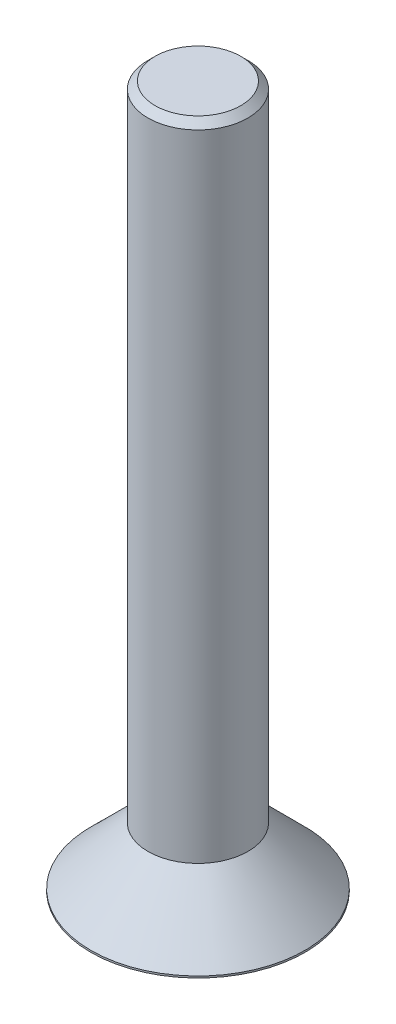
ISO-10303-21;
HEADER;
FILE_DESCRIPTION(('STEP AP214'),'2;1');
FILE_NAME('part.step','',(''),(''),'','','');
FILE_SCHEMA(('AUTOMOTIVE_DESIGN { 1 0 10303 214 1 1 1 1 }'));
ENDSEC;
DATA;
#1=APPLICATION_CONTEXT('core data for automotive mechanical design processes');
#2=APPLICATION_PROTOCOL_DEFINITION('international standard','automotive_design',2000,#1);
#3=PRODUCT_CONTEXT('',#1,'mechanical');
#4=PRODUCT('Part','Part','',(#3));
#5=PRODUCT_RELATED_PRODUCT_CATEGORY('part','',(#4));
#6=PRODUCT_DEFINITION_FORMATION('','',#4);
#7=PRODUCT_DEFINITION_CONTEXT('part definition',#1,'design');
#8=PRODUCT_DEFINITION('design','',#6,#7);
#9=PRODUCT_DEFINITION_SHAPE('','',#8);
#10=(LENGTH_UNIT() NAMED_UNIT(*) SI_UNIT(.MILLI.,.METRE.));
#11=(NAMED_UNIT(*) PLANE_ANGLE_UNIT() SI_UNIT($,.RADIAN.));
#12=(NAMED_UNIT(*) SI_UNIT($,.STERADIAN.) SOLID_ANGLE_UNIT());
#13=UNCERTAINTY_MEASURE_WITH_UNIT(LENGTH_MEASURE(1.E-05),#10,'distance_accuracy_value','');
#14=(GEOMETRIC_REPRESENTATION_CONTEXT(3) GLOBAL_UNCERTAINTY_ASSIGNED_CONTEXT((#13)) GLOBAL_UNIT_ASSIGNED_CONTEXT((#10,
#11,#12)) REPRESENTATION_CONTEXT('',''));
#15=CARTESIAN_POINT('',(0.,0.,0.));
#16=DIRECTION('',(0.,0.,1.));
#17=DIRECTION('',(1.,0.,0.));
#18=AXIS2_PLACEMENT_3D('',#15,#16,#17);
#19=CARTESIAN_POINT('',(0.,1.65,0.));
#20=DIRECTION('',(0.,-1.,0.));
#21=DIRECTION('',(0.,0.,-1.));
#22=AXIS2_PLACEMENT_3D('',#19,#20,#21);
#23=CYLINDRICAL_SURFACE('',#22,3.);
#24=CARTESIAN_POINT('',(0.,0.0499999999999921,0.));
#25=DIRECTION('',(0.,1.,0.));
#26=DIRECTION('',(0.,0.,1.));
#27=AXIS2_PLACEMENT_3D('',#24,#25,#26);
#28=CIRCLE('',#27,3.);
#29=CARTESIAN_POINT('',(0.,0.0499999999999921,3.));
#30=VERTEX_POINT('',#29);
#31=EDGE_CURVE('E150',#30,#30,#28,.F.);
#32=ORIENTED_EDGE('',*,*,#31,.T.);
#33=EDGE_LOOP('',(#32));
#34=FACE_BOUND('',#33,.T.);
#35=CARTESIAN_POINT('',(0.,0.,0.));
#36=DIRECTION('',(0.,1.,0.));
#37=DIRECTION('',(0.,0.,1.));
#38=AXIS2_PLACEMENT_3D('',#35,#36,#37);
#39=CIRCLE('',#38,3.);
#40=CARTESIAN_POINT('',(0.,0.,3.));
#41=VERTEX_POINT('',#40);
#42=EDGE_CURVE('E139',#41,#41,#39,.T.);
#43=ORIENTED_EDGE('',*,*,#42,.T.);
#44=EDGE_LOOP('',(#43));
#45=FACE_BOUND('',#44,.T.);
#46=ADVANCED_FACE('F36',(#34,#45),#23,.T.);
#47=CARTESIAN_POINT('',(0.,0.,0.));
#48=DIRECTION('',(0.,1.,0.));
#49=DIRECTION('',(0.,0.,1.));
#50=AXIS2_PLACEMENT_3D('',#47,#48,#49);
#51=PLANE('',#50);
#52=DIRECTION('',(0.,0.,1.));
#53=VECTOR('',#52,1.);
#54=CARTESIAN_POINT('',(1.,0.,-0.577350269189627));
#55=LINE('',#54,#53);
#56=CARTESIAN_POINT('',(1.,0.,-0.577350269189627));
#57=VERTEX_POINT('',#56);
#58=CARTESIAN_POINT('',(1.,0.,0.577350269189626));
#59=VERTEX_POINT('',#58);
#60=EDGE_CURVE('E126',#57,#59,#55,.T.);
#61=ORIENTED_EDGE('',*,*,#60,.F.);
#62=DIRECTION('',(0.866025403784439,0.,0.5));
#63=VECTOR('',#62,1.);
#64=CARTESIAN_POINT('',(0.,0.,-1.15470053837925));
#65=LINE('',#64,#63);
#66=CARTESIAN_POINT('',(0.,0.,-1.15470053837925));
#67=VERTEX_POINT('',#66);
#68=EDGE_CURVE('E52',#67,#57,#65,.T.);
#69=ORIENTED_EDGE('',*,*,#68,.F.);
#70=DIRECTION('',(0.866025403784439,0.,-0.5));
#71=VECTOR('',#70,1.);
#72=CARTESIAN_POINT('',(-1.,0.,-0.577350269189626));
#73=LINE('',#72,#71);
#74=CARTESIAN_POINT('',(-1.,0.,-0.577350269189626));
#75=VERTEX_POINT('',#74);
#76=EDGE_CURVE('E135',#75,#67,#73,.T.);
#77=ORIENTED_EDGE('',*,*,#76,.F.);
#78=DIRECTION('',(0.,0.,-1.));
#79=VECTOR('',#78,1.);
#80=CARTESIAN_POINT('',(-1.,0.,0.577350269189626));
#81=LINE('',#80,#79);
#82=CARTESIAN_POINT('',(-1.,0.,0.577350269189626));
#83=VERTEX_POINT('',#82);
#84=EDGE_CURVE('E133',#83,#75,#81,.T.);
#85=ORIENTED_EDGE('',*,*,#84,.F.);
#86=DIRECTION('',(-0.866025403784439,0.,-0.5));
#87=VECTOR('',#86,1.);
#88=CARTESIAN_POINT('',(0.,0.,1.15470053837925));
#89=LINE('',#88,#87);
#90=CARTESIAN_POINT('',(0.,0.,1.15470053837925));
#91=VERTEX_POINT('',#90);
#92=EDGE_CURVE('E100',#91,#83,#89,.T.);
#93=ORIENTED_EDGE('',*,*,#92,.F.);
#94=DIRECTION('',(-0.866025403784439,0.,0.5));
#95=VECTOR('',#94,1.);
#96=CARTESIAN_POINT('',(1.,0.,0.577350269189626));
#97=LINE('',#96,#95);
#98=EDGE_CURVE('E129',#59,#91,#97,.T.);
#99=ORIENTED_EDGE('',*,*,#98,.F.);
#100=EDGE_LOOP('',(#61,#69,#77,#85,#93,#99));
#101=FACE_BOUND('',#100,.T.);
#102=ORIENTED_EDGE('',*,*,#42,.F.);
#103=EDGE_LOOP('',(#102));
#104=FACE_BOUND('',#103,.T.);
#105=ADVANCED_FACE('F166',(#101,#104),#51,.F.);
#106=CARTESIAN_POINT('',(0.,1.65,0.));
#107=DIRECTION('',(0.,-1.,0.));
#108=DIRECTION('',(0.,0.,-1.));
#109=AXIS2_PLACEMENT_3D('',#106,#107,#108);
#110=CONICAL_SURFACE('',#109,1.4,0.785398163397447);
#111=ORIENTED_EDGE('',*,*,#31,.F.);
#112=EDGE_LOOP('',(#111));
#113=FACE_BOUND('',#112,.T.);
#114=CARTESIAN_POINT('',(0.,1.65,0.));
#115=DIRECTION('',(0.,1.,0.));
#116=DIRECTION('',(0.,0.,1.));
#117=AXIS2_PLACEMENT_3D('',#114,#115,#116);
#118=CIRCLE('',#117,1.4);
#119=CARTESIAN_POINT('',(0.,1.65,1.4));
#120=VERTEX_POINT('',#119);
#121=EDGE_CURVE('E147',#120,#120,#118,.T.);
#122=ORIENTED_EDGE('',*,*,#121,.F.);
#123=EDGE_LOOP('',(#122));
#124=FACE_BOUND('',#123,.T.);
#125=ADVANCED_FACE('F172',(#113,#124),#110,.T.);
#126=CARTESIAN_POINT('',(0.,0.95,-1.15470053837925));
#127=DIRECTION('',(0.5,0.,-0.866025403784439));
#128=DIRECTION('',(-0.866025403784439,0.,-0.5));
#129=AXIS2_PLACEMENT_3D('',#126,#127,#128);
#130=PLANE('',#129);
#131=ORIENTED_EDGE('',*,*,#68,.T.);
#132=DIRECTION('',(0.,-1.,0.));
#133=VECTOR('',#132,1.);
#134=CARTESIAN_POINT('',(1.,0.95,-0.577350269189627));
#135=LINE('',#134,#133);
#136=CARTESIAN_POINT('',(1.,0.95,-0.577350269189627));
#137=VERTEX_POINT('',#136);
#138=EDGE_CURVE('E82',#137,#57,#135,.T.);
#139=ORIENTED_EDGE('',*,*,#138,.F.);
#140=DIRECTION('',(0.866025403784439,0.,0.5));
#141=VECTOR('',#140,1.);
#142=CARTESIAN_POINT('',(0.,0.95,-1.15470053837925));
#143=LINE('',#142,#141);
#144=CARTESIAN_POINT('',(0.,0.95,-1.15470053837925));
#145=VERTEX_POINT('',#144);
#146=EDGE_CURVE('E137',#145,#137,#143,.T.);
#147=ORIENTED_EDGE('',*,*,#146,.F.);
#148=DIRECTION('',(0.,-1.,0.));
#149=VECTOR('',#148,1.);
#150=CARTESIAN_POINT('',(0.,0.95,-1.15470053837925));
#151=LINE('',#150,#149);
#152=EDGE_CURVE('E60',#145,#67,#151,.T.);
#153=ORIENTED_EDGE('',*,*,#152,.T.);
#154=EDGE_LOOP('',(#131,#139,#147,#153));
#155=FACE_BOUND('',#154,.T.);
#156=ADVANCED_FACE('F181',(#155),#130,.F.);
#157=CARTESIAN_POINT('',(-1.,0.95,-0.577350269189626));
#158=DIRECTION('',(-0.5,0.,-0.866025403784439));
#159=DIRECTION('',(-0.866025403784439,0.,0.5));
#160=AXIS2_PLACEMENT_3D('',#157,#158,#159);
#161=PLANE('',#160);
#162=ORIENTED_EDGE('',*,*,#76,.T.);
#163=ORIENTED_EDGE('',*,*,#152,.F.);
#164=DIRECTION('',(0.866025403784439,0.,-0.5));
#165=VECTOR('',#164,1.);
#166=CARTESIAN_POINT('',(-1.,0.95,-0.577350269189626));
#167=LINE('',#166,#165);
#168=CARTESIAN_POINT('',(-1.,0.95,-0.577350269189626));
#169=VERTEX_POINT('',#168);
#170=EDGE_CURVE('E112',#169,#145,#167,.T.);
#171=ORIENTED_EDGE('',*,*,#170,.F.);
#172=DIRECTION('',(0.,-1.,0.));
#173=VECTOR('',#172,1.);
#174=CARTESIAN_POINT('',(-1.,0.95,-0.577350269189626));
#175=LINE('',#174,#173);
#176=EDGE_CURVE('E104',#169,#75,#175,.T.);
#177=ORIENTED_EDGE('',*,*,#176,.T.);
#178=EDGE_LOOP('',(#162,#163,#171,#177));
#179=FACE_BOUND('',#178,.T.);
#180=ADVANCED_FACE('F186',(#179),#161,.F.);
#181=CARTESIAN_POINT('',(-1.,0.95,0.577350269189626));
#182=DIRECTION('',(-1.,0.,0.));
#183=DIRECTION('',(0.,0.,1.));
#184=AXIS2_PLACEMENT_3D('',#181,#182,#183);
#185=PLANE('',#184);
#186=ORIENTED_EDGE('',*,*,#84,.T.);
#187=ORIENTED_EDGE('',*,*,#176,.F.);
#188=DIRECTION('',(0.,0.,-1.));
#189=VECTOR('',#188,1.);
#190=CARTESIAN_POINT('',(-1.,0.95,0.577350269189626));
#191=LINE('',#190,#189);
#192=CARTESIAN_POINT('',(-1.,0.95,0.577350269189626));
#193=VERTEX_POINT('',#192);
#194=EDGE_CURVE('E108',#193,#169,#191,.T.);
#195=ORIENTED_EDGE('',*,*,#194,.F.);
#196=DIRECTION('',(0.,-1.,0.));
#197=VECTOR('',#196,1.);
#198=CARTESIAN_POINT('',(-1.,0.95,0.577350269189626));
#199=LINE('',#198,#197);
#200=EDGE_CURVE('E93',#193,#83,#199,.T.);
#201=ORIENTED_EDGE('',*,*,#200,.T.);
#202=EDGE_LOOP('',(#186,#187,#195,#201));
#203=FACE_BOUND('',#202,.T.);
#204=ADVANCED_FACE('F109',(#203),#185,.F.);
#205=CARTESIAN_POINT('',(0.,0.95,1.15470053837925));
#206=DIRECTION('',(-0.5,0.,0.866025403784439));
#207=DIRECTION('',(0.866025403784439,0.,0.5));
#208=AXIS2_PLACEMENT_3D('',#205,#206,#207);
#209=PLANE('',#208);
#210=ORIENTED_EDGE('',*,*,#92,.T.);
#211=ORIENTED_EDGE('',*,*,#200,.F.);
#212=DIRECTION('',(-0.866025403784439,0.,-0.5));
#213=VECTOR('',#212,1.);
#214=CARTESIAN_POINT('',(0.,0.95,1.15470053837925));
#215=LINE('',#214,#213);
#216=CARTESIAN_POINT('',(0.,0.95,1.15470053837925));
#217=VERTEX_POINT('',#216);
#218=EDGE_CURVE('E97',#217,#193,#215,.T.);
#219=ORIENTED_EDGE('',*,*,#218,.F.);
#220=DIRECTION('',(0.,-1.,0.));
#221=VECTOR('',#220,1.);
#222=CARTESIAN_POINT('',(0.,0.95,1.15470053837925));
#223=LINE('',#222,#221);
#224=EDGE_CURVE('E105',#217,#91,#223,.T.);
#225=ORIENTED_EDGE('',*,*,#224,.T.);
#226=EDGE_LOOP('',(#210,#211,#219,#225));
#227=FACE_BOUND('',#226,.T.);
#228=ADVANCED_FACE('F95',(#227),#209,.F.);
#229=CARTESIAN_POINT('',(1.,0.95,0.577350269189626));
#230=DIRECTION('',(0.5,0.,0.866025403784439));
#231=DIRECTION('',(0.866025403784439,0.,-0.5));
#232=AXIS2_PLACEMENT_3D('',#229,#230,#231);
#233=PLANE('',#232);
#234=ORIENTED_EDGE('',*,*,#98,.T.);
#235=ORIENTED_EDGE('',*,*,#224,.F.);
#236=DIRECTION('',(-0.866025403784439,0.,0.5));
#237=VECTOR('',#236,1.);
#238=CARTESIAN_POINT('',(1.,0.95,0.577350269189626));
#239=LINE('',#238,#237);
#240=CARTESIAN_POINT('',(1.,0.95,0.577350269189626));
#241=VERTEX_POINT('',#240);
#242=EDGE_CURVE('E118',#241,#217,#239,.T.);
#243=ORIENTED_EDGE('',*,*,#242,.F.);
#244=DIRECTION('',(0.,-1.,0.));
#245=VECTOR('',#244,1.);
#246=CARTESIAN_POINT('',(1.,0.95,0.577350269189626));
#247=LINE('',#246,#245);
#248=EDGE_CURVE('E142',#241,#59,#247,.T.);
#249=ORIENTED_EDGE('',*,*,#248,.T.);
#250=EDGE_LOOP('',(#234,#235,#243,#249));
#251=FACE_BOUND('',#250,.T.);
#252=ADVANCED_FACE('F206',(#251),#233,.F.);
#253=CARTESIAN_POINT('',(1.,0.95,-0.577350269189627));
#254=DIRECTION('',(1.,0.,0.));
#255=DIRECTION('',(0.,0.,-1.));
#256=AXIS2_PLACEMENT_3D('',#253,#254,#255);
#257=PLANE('',#256);
#258=ORIENTED_EDGE('',*,*,#60,.T.);
#259=ORIENTED_EDGE('',*,*,#248,.F.);
#260=DIRECTION('',(0.,0.,1.));
#261=VECTOR('',#260,1.);
#262=CARTESIAN_POINT('',(1.,0.95,-0.577350269189627));
#263=LINE('',#262,#261);
#264=EDGE_CURVE('E120',#137,#241,#263,.T.);
#265=ORIENTED_EDGE('',*,*,#264,.F.);
#266=ORIENTED_EDGE('',*,*,#138,.T.);
#267=EDGE_LOOP('',(#258,#259,#265,#266));
#268=FACE_BOUND('',#267,.T.);
#269=ADVANCED_FACE('F197',(#268),#257,.F.);
#270=CARTESIAN_POINT('',(0.,0.95,0.));
#271=DIRECTION('',(0.,-1.,0.));
#272=DIRECTION('',(0.,0.,-1.));
#273=AXIS2_PLACEMENT_3D('',#270,#271,#272);
#274=PLANE('',#273);
#275=ORIENTED_EDGE('',*,*,#146,.T.);
#276=ORIENTED_EDGE('',*,*,#264,.T.);
#277=ORIENTED_EDGE('',*,*,#242,.T.);
#278=ORIENTED_EDGE('',*,*,#218,.T.);
#279=ORIENTED_EDGE('',*,*,#194,.T.);
#280=ORIENTED_EDGE('',*,*,#170,.T.);
#281=EDGE_LOOP('',(#275,#276,#277,#278,#279,#280));
#282=FACE_BOUND('',#281,.T.);
#283=ADVANCED_FACE('F115',(#282),#274,.T.);
#284=CARTESIAN_POINT('',(0.,19.65,0.));
#285=DIRECTION('',(0.,-1.,0.));
#286=DIRECTION('',(0.,0.,-1.));
#287=AXIS2_PLACEMENT_3D('',#284,#285,#286);
#288=CYLINDRICAL_SURFACE('',#287,1.4);
#289=CARTESIAN_POINT('',(0.,19.45,0.));
#290=DIRECTION('',(0.,1.,0.));
#291=DIRECTION('',(0.,0.,1.));
#292=AXIS2_PLACEMENT_3D('',#289,#290,#291);
#293=CIRCLE('',#292,1.4);
#294=CARTESIAN_POINT('',(0.,19.45,1.4));
#295=VERTEX_POINT('',#294);
#296=EDGE_CURVE('E11',#295,#295,#293,.F.);
#297=ORIENTED_EDGE('',*,*,#296,.T.);
#298=EDGE_LOOP('',(#297));
#299=FACE_BOUND('',#298,.T.);
#300=ORIENTED_EDGE('',*,*,#121,.T.);
#301=EDGE_LOOP('',(#300));
#302=FACE_BOUND('',#301,.T.);
#303=ADVANCED_FACE('F162',(#299,#302),#288,.T.);
#304=CARTESIAN_POINT('',(0.,19.65,0.));
#305=DIRECTION('',(0.,1.,0.));
#306=DIRECTION('',(0.,0.,1.));
#307=AXIS2_PLACEMENT_3D('',#304,#305,#306);
#308=PLANE('',#307);
#309=CARTESIAN_POINT('',(0.,19.65,0.));
#310=DIRECTION('',(0.,1.,0.));
#311=DIRECTION('',(0.,0.,1.));
#312=AXIS2_PLACEMENT_3D('',#309,#310,#311);
#313=CIRCLE('',#312,1.2);
#314=CARTESIAN_POINT('',(0.,19.65,1.2));
#315=VERTEX_POINT('',#314);
#316=EDGE_CURVE('E45',#315,#315,#313,.T.);
#317=ORIENTED_EDGE('',*,*,#316,.T.);
#318=EDGE_LOOP('',(#317));
#319=FACE_BOUND('',#318,.T.);
#320=ADVANCED_FACE('F155',(#319),#308,.T.);
#321=CARTESIAN_POINT('',(0.,19.65,0.));
#322=DIRECTION('',(0.,-1.,0.));
#323=DIRECTION('',(0.,0.,-1.));
#324=AXIS2_PLACEMENT_3D('',#321,#322,#323);
#325=CONICAL_SURFACE('',#324,1.2,0.785398163397444);
#326=ORIENTED_EDGE('',*,*,#296,.F.);
#327=EDGE_LOOP('',(#326));
#328=FACE_BOUND('',#327,.T.);
#329=ORIENTED_EDGE('',*,*,#316,.F.);
#330=EDGE_LOOP('',(#329));
#331=FACE_BOUND('',#330,.T.);
#332=ADVANCED_FACE('F39',(#328,#331),#325,.T.);
#333=CLOSED_SHELL('',(#46,#105,#125,#156,#180,#204,#228,#252,#269,#283,#303,#320,#332));
#334=MANIFOLD_SOLID_BREP('B2',#333);
#335=ADVANCED_BREP_SHAPE_REPRESENTATION('',(#18,#334),#14);
#336=SHAPE_DEFINITION_REPRESENTATION(#9,#335);
ENDSEC;
END-ISO-10303-21;
